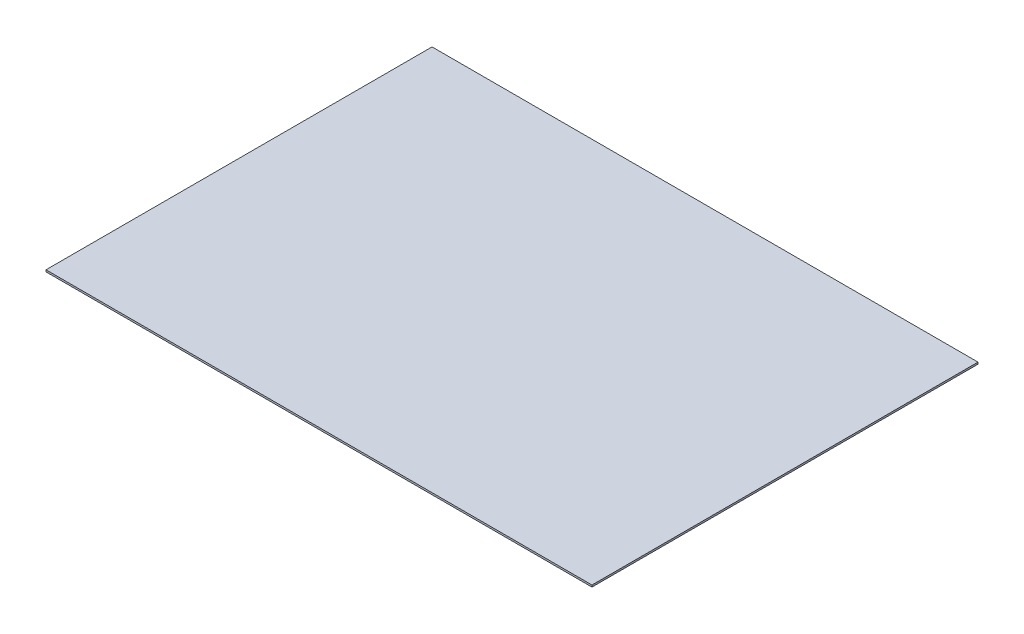
ISO-10303-21;
HEADER;
FILE_DESCRIPTION(('STEP AP214'),'2;1');
FILE_NAME('part.step','',(''),(''),'','','');
FILE_SCHEMA(('AUTOMOTIVE_DESIGN { 1 0 10303 214 1 1 1 1 }'));
ENDSEC;
DATA;
#1=APPLICATION_CONTEXT('core data for automotive mechanical design processes');
#2=APPLICATION_PROTOCOL_DEFINITION('international standard','automotive_design',2000,#1);
#3=PRODUCT_CONTEXT('',#1,'mechanical');
#4=PRODUCT('Part','Part','',(#3));
#5=PRODUCT_RELATED_PRODUCT_CATEGORY('part','',(#4));
#6=PRODUCT_DEFINITION_FORMATION('','',#4);
#7=PRODUCT_DEFINITION_CONTEXT('part definition',#1,'design');
#8=PRODUCT_DEFINITION('design','',#6,#7);
#9=PRODUCT_DEFINITION_SHAPE('','',#8);
#10=(LENGTH_UNIT() NAMED_UNIT(*) SI_UNIT(.MILLI.,.METRE.));
#11=(NAMED_UNIT(*) PLANE_ANGLE_UNIT() SI_UNIT($,.RADIAN.));
#12=(NAMED_UNIT(*) SI_UNIT($,.STERADIAN.) SOLID_ANGLE_UNIT());
#13=UNCERTAINTY_MEASURE_WITH_UNIT(LENGTH_MEASURE(1.E-05),#10,'distance_accuracy_value','');
#14=(GEOMETRIC_REPRESENTATION_CONTEXT(3) GLOBAL_UNCERTAINTY_ASSIGNED_CONTEXT((#13)) GLOBAL_UNIT_ASSIGNED_CONTEXT((#10,
#11,#12)) REPRESENTATION_CONTEXT('',''));
#15=CARTESIAN_POINT('',(0.,0.,0.));
#16=DIRECTION('',(0.,0.,1.));
#17=DIRECTION('',(1.,0.,0.));
#18=AXIS2_PLACEMENT_3D('',#15,#16,#17);
#19=CARTESIAN_POINT('',(0.,1.,0.));
#20=DIRECTION('',(1.,0.,0.));
#21=DIRECTION('',(0.,0.,-1.));
#22=AXIS2_PLACEMENT_3D('',#19,#20,#21);
#23=PLANE('',#22);
#24=DIRECTION('',(0.,0.,1.));
#25=VECTOR('',#24,1.);
#26=CARTESIAN_POINT('',(0.,0.,0.));
#27=LINE('',#26,#25);
#28=CARTESIAN_POINT('',(0.,0.,-210.));
#29=VERTEX_POINT('',#28);
#30=CARTESIAN_POINT('',(0.,0.,0.));
#31=VERTEX_POINT('',#30);
#32=EDGE_CURVE('E100',#29,#31,#27,.T.);
#33=ORIENTED_EDGE('',*,*,#32,.T.);
#34=DIRECTION('',(0.,-1.,0.));
#35=VECTOR('',#34,1.);
#36=CARTESIAN_POINT('',(0.,1.,0.));
#37=LINE('',#36,#35);
#38=CARTESIAN_POINT('',(0.,1.,0.));
#39=VERTEX_POINT('',#38);
#40=EDGE_CURVE('E11',#39,#31,#37,.T.);
#41=ORIENTED_EDGE('',*,*,#40,.F.);
#42=DIRECTION('',(0.,0.,1.));
#43=VECTOR('',#42,1.);
#44=CARTESIAN_POINT('',(0.,1.,0.));
#45=LINE('',#44,#43);
#46=CARTESIAN_POINT('',(0.,1.,-210.));
#47=VERTEX_POINT('',#46);
#48=EDGE_CURVE('E88',#47,#39,#45,.T.);
#49=ORIENTED_EDGE('',*,*,#48,.F.);
#50=DIRECTION('',(0.,-1.,0.));
#51=VECTOR('',#50,1.);
#52=CARTESIAN_POINT('',(0.,1.,-210.));
#53=LINE('',#52,#51);
#54=EDGE_CURVE('E96',#47,#29,#53,.T.);
#55=ORIENTED_EDGE('',*,*,#54,.T.);
#56=EDGE_LOOP('',(#33,#41,#49,#55));
#57=FACE_BOUND('',#56,.T.);
#58=ADVANCED_FACE('F37',(#57),#23,.F.);
#59=CARTESIAN_POINT('',(0.,1.,0.));
#60=DIRECTION('',(0.,0.,-1.));
#61=DIRECTION('',(-1.,0.,0.));
#62=AXIS2_PLACEMENT_3D('',#59,#60,#61);
#63=PLANE('',#62);
#64=DIRECTION('',(1.,0.,0.));
#65=VECTOR('',#64,1.);
#66=CARTESIAN_POINT('',(0.,0.,0.));
#67=LINE('',#66,#65);
#68=CARTESIAN_POINT('',(297.,0.,0.));
#69=VERTEX_POINT('',#68);
#70=EDGE_CURVE('E92',#31,#69,#67,.T.);
#71=ORIENTED_EDGE('',*,*,#70,.T.);
#72=DIRECTION('',(0.,-1.,0.));
#73=VECTOR('',#72,1.);
#74=CARTESIAN_POINT('',(297.,1.,0.));
#75=LINE('',#74,#73);
#76=CARTESIAN_POINT('',(297.,1.,0.));
#77=VERTEX_POINT('',#76);
#78=EDGE_CURVE('E45',#77,#69,#75,.T.);
#79=ORIENTED_EDGE('',*,*,#78,.F.);
#80=DIRECTION('',(1.,0.,0.));
#81=VECTOR('',#80,1.);
#82=CARTESIAN_POINT('',(0.,1.,0.));
#83=LINE('',#82,#81);
#84=EDGE_CURVE('E83',#39,#77,#83,.T.);
#85=ORIENTED_EDGE('',*,*,#84,.F.);
#86=ORIENTED_EDGE('',*,*,#40,.T.);
#87=EDGE_LOOP('',(#71,#79,#85,#86));
#88=FACE_BOUND('',#87,.T.);
#89=ADVANCED_FACE('F91',(#88),#63,.F.);
#90=CARTESIAN_POINT('',(297.,1.,0.));
#91=DIRECTION('',(-1.,0.,0.));
#92=DIRECTION('',(0.,0.,1.));
#93=AXIS2_PLACEMENT_3D('',#90,#91,#92);
#94=PLANE('',#93);
#95=DIRECTION('',(0.,0.,-1.));
#96=VECTOR('',#95,1.);
#97=CARTESIAN_POINT('',(297.,0.,0.));
#98=LINE('',#97,#96);
#99=CARTESIAN_POINT('',(297.,0.,-210.));
#100=VERTEX_POINT('',#99);
#101=EDGE_CURVE('E70',#69,#100,#98,.T.);
#102=ORIENTED_EDGE('',*,*,#101,.T.);
#103=DIRECTION('',(0.,-1.,0.));
#104=VECTOR('',#103,1.);
#105=CARTESIAN_POINT('',(297.,1.,-210.));
#106=LINE('',#105,#104);
#107=CARTESIAN_POINT('',(297.,1.,-210.));
#108=VERTEX_POINT('',#107);
#109=EDGE_CURVE('E93',#108,#100,#106,.T.);
#110=ORIENTED_EDGE('',*,*,#109,.F.);
#111=DIRECTION('',(0.,0.,-1.));
#112=VECTOR('',#111,1.);
#113=CARTESIAN_POINT('',(297.,1.,0.));
#114=LINE('',#113,#112);
#115=EDGE_CURVE('E86',#77,#108,#114,.T.);
#116=ORIENTED_EDGE('',*,*,#115,.F.);
#117=ORIENTED_EDGE('',*,*,#78,.T.);
#118=EDGE_LOOP('',(#102,#110,#116,#117));
#119=FACE_BOUND('',#118,.T.);
#120=ADVANCED_FACE('F94',(#119),#94,.F.);
#121=CARTESIAN_POINT('',(0.,1.,-210.));
#122=DIRECTION('',(0.,0.,1.));
#123=DIRECTION('',(1.,0.,0.));
#124=AXIS2_PLACEMENT_3D('',#121,#122,#123);
#125=PLANE('',#124);
#126=DIRECTION('',(-1.,0.,0.));
#127=VECTOR('',#126,1.);
#128=CARTESIAN_POINT('',(0.,0.,-210.));
#129=LINE('',#128,#127);
#130=EDGE_CURVE('E76',#100,#29,#129,.T.);
#131=ORIENTED_EDGE('',*,*,#130,.T.);
#132=ORIENTED_EDGE('',*,*,#54,.F.);
#133=DIRECTION('',(-1.,0.,0.));
#134=VECTOR('',#133,1.);
#135=CARTESIAN_POINT('',(0.,1.,-210.));
#136=LINE('',#135,#134);
#137=EDGE_CURVE('E53',#108,#47,#136,.T.);
#138=ORIENTED_EDGE('',*,*,#137,.F.);
#139=ORIENTED_EDGE('',*,*,#109,.T.);
#140=EDGE_LOOP('',(#131,#132,#138,#139));
#141=FACE_BOUND('',#140,.T.);
#142=ADVANCED_FACE('F107',(#141),#125,.F.);
#143=CARTESIAN_POINT('',(0.,1.,0.));
#144=DIRECTION('',(0.,-1.,0.));
#145=DIRECTION('',(0.,0.,-1.));
#146=AXIS2_PLACEMENT_3D('',#143,#144,#145);
#147=PLANE('',#146);
#148=ORIENTED_EDGE('',*,*,#48,.T.);
#149=ORIENTED_EDGE('',*,*,#84,.T.);
#150=ORIENTED_EDGE('',*,*,#115,.T.);
#151=ORIENTED_EDGE('',*,*,#137,.T.);
#152=EDGE_LOOP('',(#148,#149,#150,#151));
#153=FACE_BOUND('',#152,.T.);
#154=ADVANCED_FACE('F84',(#153),#147,.F.);
#155=CARTESIAN_POINT('',(0.,0.,0.));
#156=DIRECTION('',(0.,-1.,0.));
#157=DIRECTION('',(0.,0.,-1.));
#158=AXIS2_PLACEMENT_3D('',#155,#156,#157);
#159=PLANE('',#158);
#160=ORIENTED_EDGE('',*,*,#32,.F.);
#161=ORIENTED_EDGE('',*,*,#130,.F.);
#162=ORIENTED_EDGE('',*,*,#101,.F.);
#163=ORIENTED_EDGE('',*,*,#70,.F.);
#164=EDGE_LOOP('',(#160,#161,#162,#163));
#165=FACE_BOUND('',#164,.T.);
#166=ADVANCED_FACE('F110',(#165),#159,.T.);
#167=CLOSED_SHELL('',(#58,#89,#120,#142,#154,#166));
#168=MANIFOLD_SOLID_BREP('B2',#167);
#169=ADVANCED_BREP_SHAPE_REPRESENTATION('',(#18,#168),#14);
#170=SHAPE_DEFINITION_REPRESENTATION(#9,#169);
ENDSEC;
END-ISO-10303-21;
